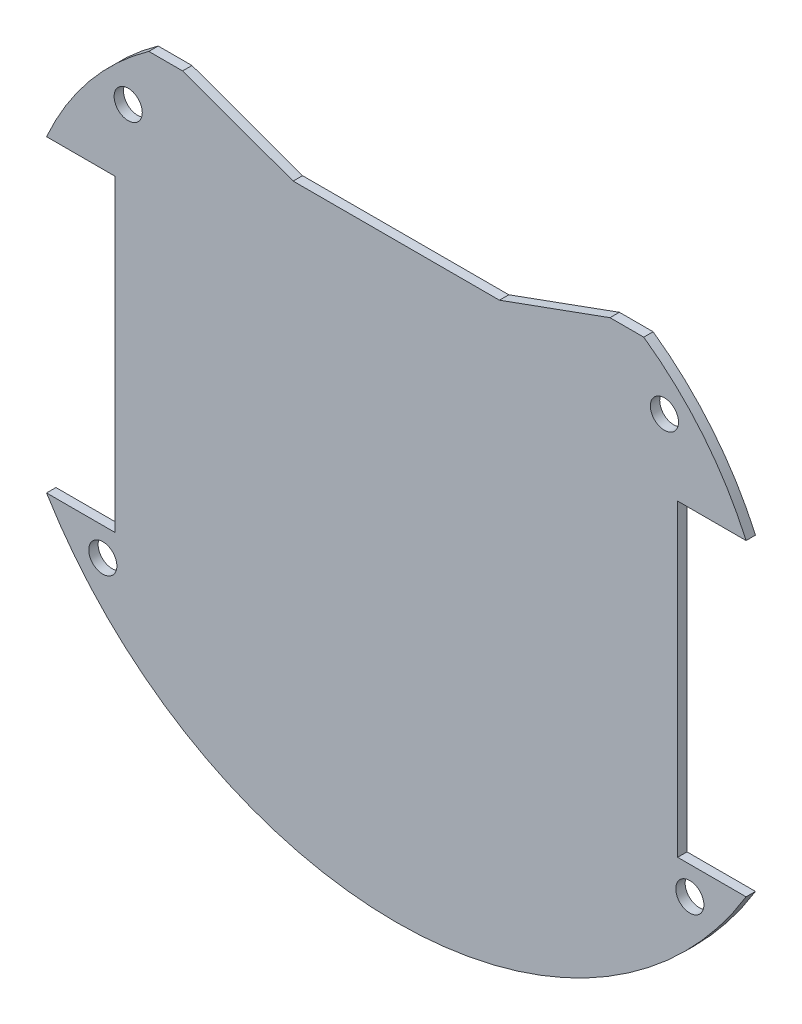
ISO-10303-21;
HEADER;
FILE_DESCRIPTION(('STEP AP214'),'2;1');
FILE_NAME('part.step','',(''),(''),'','','');
FILE_SCHEMA(('AUTOMOTIVE_DESIGN { 1 0 10303 214 1 1 1 1 }'));
ENDSEC;
DATA;
#1=APPLICATION_CONTEXT('core data for automotive mechanical design processes');
#2=APPLICATION_PROTOCOL_DEFINITION('international standard','automotive_design',2000,#1);
#3=PRODUCT_CONTEXT('',#1,'mechanical');
#4=PRODUCT('Part','Part','',(#3));
#5=PRODUCT_RELATED_PRODUCT_CATEGORY('part','',(#4));
#6=PRODUCT_DEFINITION_FORMATION('','',#4);
#7=PRODUCT_DEFINITION_CONTEXT('part definition',#1,'design');
#8=PRODUCT_DEFINITION('design','',#6,#7);
#9=PRODUCT_DEFINITION_SHAPE('','',#8);
#10=(LENGTH_UNIT() NAMED_UNIT(*) SI_UNIT(.MILLI.,.METRE.));
#11=(NAMED_UNIT(*) PLANE_ANGLE_UNIT() SI_UNIT($,.RADIAN.));
#12=(NAMED_UNIT(*) SI_UNIT($,.STERADIAN.) SOLID_ANGLE_UNIT());
#13=UNCERTAINTY_MEASURE_WITH_UNIT(LENGTH_MEASURE(1.E-05),#10,'distance_accuracy_value','');
#14=(GEOMETRIC_REPRESENTATION_CONTEXT(3) GLOBAL_UNCERTAINTY_ASSIGNED_CONTEXT((#13)) GLOBAL_UNIT_ASSIGNED_CONTEXT((#10,
#11,#12)) REPRESENTATION_CONTEXT('',''));
#15=CARTESIAN_POINT('',(0.,0.,0.));
#16=DIRECTION('',(0.,0.,1.));
#17=DIRECTION('',(1.,0.,0.));
#18=AXIS2_PLACEMENT_3D('',#15,#16,#17);
#19=CARTESIAN_POINT('',(0.,0.,0.));
#20=DIRECTION('',(0.,0.,1.));
#21=DIRECTION('',(1.,0.,0.));
#22=AXIS2_PLACEMENT_3D('',#19,#20,#21);
#23=PLANE('',#22);
#24=CARTESIAN_POINT('',(-31.299711921146,-19.4492983568228,0.));
#25=DIRECTION('',(0.,0.,1.));
#26=DIRECTION('',(1.,0.,0.));
#27=AXIS2_PLACEMENT_3D('',#24,#25,#26);
#28=CIRCLE('',#27,1.5);
#29=CARTESIAN_POINT('',(-29.799711921146,-19.4492983568228,0.));
#30=VERTEX_POINT('',#29);
#31=EDGE_CURVE('E146',#30,#30,#28,.T.);
#32=ORIENTED_EDGE('',*,*,#31,.T.);
#33=EDGE_LOOP('',(#32));
#34=FACE_BOUND('',#33,.T.);
#35=CARTESIAN_POINT('',(31.2997119211459,-19.4492983568228,0.));
#36=DIRECTION('',(0.,0.,1.));
#37=DIRECTION('',(1.,0.,0.));
#38=AXIS2_PLACEMENT_3D('',#35,#36,#37);
#39=CIRCLE('',#38,1.5);
#40=CARTESIAN_POINT('',(32.7997119211459,-19.4492983568228,0.));
#41=VERTEX_POINT('',#40);
#42=EDGE_CURVE('E484',#41,#41,#39,.T.);
#43=ORIENTED_EDGE('',*,*,#42,.T.);
#44=EDGE_LOOP('',(#43));
#45=FACE_BOUND('',#44,.T.);
#46=CARTESIAN_POINT('',(-28.5900387108147,23.7802641955972,0.));
#47=DIRECTION('',(0.,0.,1.));
#48=DIRECTION('',(1.,0.,0.));
#49=AXIS2_PLACEMENT_3D('',#46,#47,#48);
#50=CIRCLE('',#49,1.5);
#51=CARTESIAN_POINT('',(-27.0900387108147,23.7802641955972,0.));
#52=VERTEX_POINT('',#51);
#53=EDGE_CURVE('E242',#52,#52,#50,.T.);
#54=ORIENTED_EDGE('',*,*,#53,.T.);
#55=EDGE_LOOP('',(#54));
#56=FACE_BOUND('',#55,.T.);
#57=CARTESIAN_POINT('',(28.5900387108147,23.7802641955972,0.));
#58=DIRECTION('',(0.,0.,1.));
#59=DIRECTION('',(-1.,0.,0.));
#60=AXIS2_PLACEMENT_3D('',#57,#58,#59);
#61=CIRCLE('',#60,1.5);
#62=CARTESIAN_POINT('',(27.0900387108147,23.7802641955972,0.));
#63=VERTEX_POINT('',#62);
#64=EDGE_CURVE('E241',#63,#63,#61,.T.);
#65=ORIENTED_EDGE('',*,*,#64,.T.);
#66=EDGE_LOOP('',(#65));
#67=FACE_BOUND('',#66,.T.);
#68=DIRECTION('',(1.,0.,0.));
#69=VECTOR('',#68,1.);
#70=CARTESIAN_POINT('',(0.,-16.4492983568228,0.));
#71=LINE('',#70,#69);
#72=CARTESIAN_POINT('',(30.,-16.4492983568228,0.));
#73=VERTEX_POINT('',#72);
#74=CARTESIAN_POINT('',(37.299711921146,-16.4492983568227,0.));
#75=VERTEX_POINT('',#74);
#76=EDGE_CURVE('E177',#73,#75,#71,.T.);
#77=ORIENTED_EDGE('',*,*,#76,.T.);
#78=CARTESIAN_POINT('',(0.,6.15877791092165,0.));
#79=DIRECTION('',(0.,0.,1.));
#80=DIRECTION('',(1.,0.,0.));
#81=AXIS2_PLACEMENT_3D('',#78,#79,#80);
#82=CIRCLE('',#81,43.6164375199147);
#83=CARTESIAN_POINT('',(-37.299711921146,-16.4492983568228,0.));
#84=VERTEX_POINT('',#83);
#85=EDGE_CURVE('E250',#84,#75,#82,.T.);
#86=ORIENTED_EDGE('',*,*,#85,.F.);
#87=DIRECTION('',(-1.,0.,0.));
#88=VECTOR('',#87,1.);
#89=CARTESIAN_POINT('',(0.,-16.4492983568228,0.));
#90=LINE('',#89,#88);
#91=CARTESIAN_POINT('',(-30.,-16.4492983568228,0.));
#92=VERTEX_POINT('',#91);
#93=EDGE_CURVE('E190',#92,#84,#90,.T.);
#94=ORIENTED_EDGE('',*,*,#93,.F.);
#95=DIRECTION('',(0.,1.,0.));
#96=VECTOR('',#95,1.);
#97=CARTESIAN_POINT('',(-30.,16.4492983568228,0.));
#98=LINE('',#97,#96);
#99=CARTESIAN_POINT('',(-30.,16.4492983568228,0.));
#100=VERTEX_POINT('',#99);
#101=EDGE_CURVE('E171',#92,#100,#98,.T.);
#102=ORIENTED_EDGE('',*,*,#101,.T.);
#103=DIRECTION('',(-1.,0.,0.));
#104=VECTOR('',#103,1.);
#105=CARTESIAN_POINT('',(0.,16.4492983568228,0.));
#106=LINE('',#105,#104);
#107=CARTESIAN_POINT('',(-37.299711921146,16.4492983568228,0.));
#108=VERTEX_POINT('',#107);
#109=EDGE_CURVE('E188',#100,#108,#106,.T.);
#110=ORIENTED_EDGE('',*,*,#109,.T.);
#111=CARTESIAN_POINT('',(-7.61252759266184,3.28373542568487,0.));
#112=DIRECTION('',(0.,0.,1.));
#113=DIRECTION('',(-1.,0.,0.));
#114=AXIS2_PLACEMENT_3D('',#111,#112,#113);
#115=CIRCLE('',#114,32.4755440392789);
#116=CARTESIAN_POINT('',(-26.3900387108147,29.7802641955972,0.));
#117=VERTEX_POINT('',#116);
#118=EDGE_CURVE('E160',#117,#108,#115,.T.);
#119=ORIENTED_EDGE('',*,*,#118,.F.);
#120=DIRECTION('',(-1.,0.,0.));
#121=VECTOR('',#120,1.);
#122=CARTESIAN_POINT('',(-22.7900387108147,29.7802641955972,0.));
#123=LINE('',#122,#121);
#124=CARTESIAN_POINT('',(-22.7900387108147,29.7802641955972,0.));
#125=VERTEX_POINT('',#124);
#126=EDGE_CURVE('E257',#125,#117,#123,.T.);
#127=ORIENTED_EDGE('',*,*,#126,.F.);
#128=DIRECTION('',(-0.939973110395639,0.341248519019714,0.));
#129=VECTOR('',#128,1.);
#130=CARTESIAN_POINT('',(6.89853694287745,19.0021021805552,0.));
#131=LINE('',#130,#129);
#132=CARTESIAN_POINT('',(-11.,25.5,0.));
#133=VERTEX_POINT('',#132);
#134=EDGE_CURVE('E192',#133,#125,#131,.T.);
#135=ORIENTED_EDGE('',*,*,#134,.F.);
#136=DIRECTION('',(-1.,0.,0.));
#137=VECTOR('',#136,1.);
#138=CARTESIAN_POINT('',(0.,25.5,0.));
#139=LINE('',#138,#137);
#140=CARTESIAN_POINT('',(11.,25.5,0.));
#141=VERTEX_POINT('',#140);
#142=EDGE_CURVE('E197',#141,#133,#139,.T.);
#143=ORIENTED_EDGE('',*,*,#142,.F.);
#144=DIRECTION('',(0.939973110395639,0.341248519019713,0.));
#145=VECTOR('',#144,1.);
#146=CARTESIAN_POINT('',(-6.89853694287744,19.0021021805552,0.));
#147=LINE('',#146,#145);
#148=CARTESIAN_POINT('',(22.7900387108147,29.7802641955972,0.));
#149=VERTEX_POINT('',#148);
#150=EDGE_CURVE('E194',#141,#149,#147,.T.);
#151=ORIENTED_EDGE('',*,*,#150,.T.);
#152=DIRECTION('',(-1.,0.,0.));
#153=VECTOR('',#152,1.);
#154=CARTESIAN_POINT('',(22.7900387108147,29.7802641955972,0.));
#155=LINE('',#154,#153);
#156=CARTESIAN_POINT('',(26.3900387108147,29.7802641955972,0.));
#157=VERTEX_POINT('',#156);
#158=EDGE_CURVE('E213',#157,#149,#155,.T.);
#159=ORIENTED_EDGE('',*,*,#158,.F.);
#160=CARTESIAN_POINT('',(7.61252759266184,3.28373542568486,0.));
#161=DIRECTION('',(0.,0.,1.));
#162=DIRECTION('',(1.,0.,0.));
#163=AXIS2_PLACEMENT_3D('',#160,#161,#162);
#164=CIRCLE('',#163,32.4755440392789);
#165=CARTESIAN_POINT('',(37.299711921146,16.4492983568228,0.));
#166=VERTEX_POINT('',#165);
#167=EDGE_CURVE('E221',#166,#157,#164,.T.);
#168=ORIENTED_EDGE('',*,*,#167,.F.);
#169=DIRECTION('',(1.,0.,0.));
#170=VECTOR('',#169,1.);
#171=CARTESIAN_POINT('',(0.,16.4492983568228,0.));
#172=LINE('',#171,#170);
#173=CARTESIAN_POINT('',(30.,16.4492983568228,0.));
#174=VERTEX_POINT('',#173);
#175=EDGE_CURVE('E186',#174,#166,#172,.T.);
#176=ORIENTED_EDGE('',*,*,#175,.F.);
#177=DIRECTION('',(0.,-1.,0.));
#178=VECTOR('',#177,1.);
#179=CARTESIAN_POINT('',(30.,16.4492983568228,0.));
#180=LINE('',#179,#178);
#181=EDGE_CURVE('E161',#174,#73,#180,.T.);
#182=ORIENTED_EDGE('',*,*,#181,.T.);
#183=EDGE_LOOP('',(#77,#86,#94,#102,#110,#119,#127,#135,#143,#151,#159,#168,#176,#182));
#184=FACE_BOUND('',#183,.T.);
#185=ADVANCED_FACE('F34',(#34,#45,#56,#67,#184),#23,.F.);
#186=CARTESIAN_POINT('',(6.89853694287745,19.0021021805552,3.));
#187=DIRECTION('',(-0.341248519019714,-0.939973110395639,0.));
#188=DIRECTION('',(0.939973110395639,-0.341248519019714,0.));
#189=AXIS2_PLACEMENT_3D('',#186,#187,#188);
#190=PLANE('',#189);
#191=DIRECTION('',(0.,0.,-1.));
#192=VECTOR('',#191,1.);
#193=CARTESIAN_POINT('',(-22.7900387108147,29.7802641955972,3.));
#194=LINE('',#193,#192);
#195=CARTESIAN_POINT('',(-22.7900387108147,29.7802641955972,1.));
#196=VERTEX_POINT('',#195);
#197=EDGE_CURVE('E11',#196,#125,#194,.T.);
#198=ORIENTED_EDGE('',*,*,#197,.F.);
#199=DIRECTION('',(-0.939973110395639,0.341248519019714,0.));
#200=VECTOR('',#199,1.);
#201=CARTESIAN_POINT('',(-11.,25.5,1.));
#202=LINE('',#201,#200);
#203=CARTESIAN_POINT('',(-11.,25.5,1.));
#204=VERTEX_POINT('',#203);
#205=EDGE_CURVE('E230',#204,#196,#202,.T.);
#206=ORIENTED_EDGE('',*,*,#205,.F.);
#207=DIRECTION('',(0.,0.,-1.));
#208=VECTOR('',#207,1.);
#209=CARTESIAN_POINT('',(-11.,25.5,3.));
#210=LINE('',#209,#208);
#211=EDGE_CURVE('E58',#204,#133,#210,.T.);
#212=ORIENTED_EDGE('',*,*,#211,.T.);
#213=ORIENTED_EDGE('',*,*,#134,.T.);
#214=EDGE_LOOP('',(#198,#206,#212,#213));
#215=FACE_BOUND('',#214,.T.);
#216=ADVANCED_FACE('F36',(#215),#190,.F.);
#217=CARTESIAN_POINT('',(-6.89853694287744,19.0021021805552,3.));
#218=DIRECTION('',(-0.341248519019714,0.939973110395639,0.));
#219=DIRECTION('',(-0.939973110395639,-0.341248519019714,0.));
#220=AXIS2_PLACEMENT_3D('',#217,#218,#219);
#221=PLANE('',#220);
#222=DIRECTION('',(-0.939973110395639,-0.341248519019713,0.));
#223=VECTOR('',#222,1.);
#224=CARTESIAN_POINT('',(22.7900387108147,29.7802641955972,1.));
#225=LINE('',#224,#223);
#226=CARTESIAN_POINT('',(22.7900387108147,29.7802641955972,1.));
#227=VERTEX_POINT('',#226);
#228=CARTESIAN_POINT('',(11.,25.5,1.));
#229=VERTEX_POINT('',#228);
#230=EDGE_CURVE('E209',#227,#229,#225,.T.);
#231=ORIENTED_EDGE('',*,*,#230,.F.);
#232=DIRECTION('',(0.,0.,-1.));
#233=VECTOR('',#232,1.);
#234=CARTESIAN_POINT('',(22.7900387108147,29.7802641955972,3.));
#235=LINE('',#234,#233);
#236=EDGE_CURVE('E43',#227,#149,#235,.T.);
#237=ORIENTED_EDGE('',*,*,#236,.T.);
#238=ORIENTED_EDGE('',*,*,#150,.F.);
#239=DIRECTION('',(0.,0.,-1.));
#240=VECTOR('',#239,1.);
#241=CARTESIAN_POINT('',(11.,25.5,3.));
#242=LINE('',#241,#240);
#243=EDGE_CURVE('E200',#229,#141,#242,.T.);
#244=ORIENTED_EDGE('',*,*,#243,.F.);
#245=EDGE_LOOP('',(#231,#237,#238,#244));
#246=FACE_BOUND('',#245,.T.);
#247=ADVANCED_FACE('F207',(#246),#221,.T.);
#248=CARTESIAN_POINT('',(0.,25.5,3.));
#249=DIRECTION('',(0.,-1.,0.));
#250=DIRECTION('',(1.,0.,0.));
#251=AXIS2_PLACEMENT_3D('',#248,#249,#250);
#252=PLANE('',#251);
#253=ORIENTED_EDGE('',*,*,#211,.F.);
#254=DIRECTION('',(-1.,0.,0.));
#255=VECTOR('',#254,1.);
#256=CARTESIAN_POINT('',(11.,25.5,1.));
#257=LINE('',#256,#255);
#258=EDGE_CURVE('E229',#229,#204,#257,.T.);
#259=ORIENTED_EDGE('',*,*,#258,.F.);
#260=ORIENTED_EDGE('',*,*,#243,.T.);
#261=ORIENTED_EDGE('',*,*,#142,.T.);
#262=EDGE_LOOP('',(#253,#259,#260,#261));
#263=FACE_BOUND('',#262,.T.);
#264=ADVANCED_FACE('F227',(#263),#252,.F.);
#265=CARTESIAN_POINT('',(0.,-16.4492983568228,0.));
#266=DIRECTION('',(0.,1.,0.));
#267=DIRECTION('',(0.,0.,1.));
#268=AXIS2_PLACEMENT_3D('',#265,#266,#267);
#269=PLANE('',#268);
#270=DIRECTION('',(-1.,0.,0.));
#271=VECTOR('',#270,1.);
#272=CARTESIAN_POINT('',(-30.,-16.4492983568228,1.));
#273=LINE('',#272,#271);
#274=CARTESIAN_POINT('',(-30.,-16.4492983568228,1.));
#275=VERTEX_POINT('',#274);
#276=CARTESIAN_POINT('',(-37.299711921146,-16.4492983568228,1.));
#277=VERTEX_POINT('',#276);
#278=EDGE_CURVE('E50',#275,#277,#273,.T.);
#279=ORIENTED_EDGE('',*,*,#278,.F.);
#280=DIRECTION('',(0.,0.,1.));
#281=VECTOR('',#280,1.);
#282=CARTESIAN_POINT('',(-30.,-16.4492983568228,0.));
#283=LINE('',#282,#281);
#284=EDGE_CURVE('E174',#92,#275,#283,.T.);
#285=ORIENTED_EDGE('',*,*,#284,.F.);
#286=ORIENTED_EDGE('',*,*,#93,.T.);
#287=DIRECTION('',(0.,0.,1.));
#288=VECTOR('',#287,1.);
#289=CARTESIAN_POINT('',(-37.299711921146,-16.4492983568228,0.));
#290=LINE('',#289,#288);
#291=EDGE_CURVE('E252',#84,#277,#290,.T.);
#292=ORIENTED_EDGE('',*,*,#291,.T.);
#293=EDGE_LOOP('',(#279,#285,#286,#292));
#294=FACE_BOUND('',#293,.T.);
#295=ADVANCED_FACE('F301',(#294),#269,.T.);
#296=CARTESIAN_POINT('',(0.,16.4492983568228,0.));
#297=DIRECTION('',(0.,1.,0.));
#298=DIRECTION('',(0.,0.,1.));
#299=AXIS2_PLACEMENT_3D('',#296,#297,#298);
#300=PLANE('',#299);
#301=DIRECTION('',(0.,0.,1.));
#302=VECTOR('',#301,1.);
#303=CARTESIAN_POINT('',(-30.,16.4492983568228,0.));
#304=LINE('',#303,#302);
#305=CARTESIAN_POINT('',(-30.,16.4492983568228,1.));
#306=VERTEX_POINT('',#305);
#307=EDGE_CURVE('E155',#100,#306,#304,.T.);
#308=ORIENTED_EDGE('',*,*,#307,.T.);
#309=DIRECTION('',(1.,0.,0.));
#310=VECTOR('',#309,1.);
#311=CARTESIAN_POINT('',(-37.299711921146,16.4492983568228,1.));
#312=LINE('',#311,#310);
#313=CARTESIAN_POINT('',(-37.299711921146,16.4492983568228,1.));
#314=VERTEX_POINT('',#313);
#315=EDGE_CURVE('E139',#314,#306,#312,.T.);
#316=ORIENTED_EDGE('',*,*,#315,.F.);
#317=DIRECTION('',(0.,0.,1.));
#318=VECTOR('',#317,1.);
#319=CARTESIAN_POINT('',(-37.299711921146,16.4492983568228,0.));
#320=LINE('',#319,#318);
#321=EDGE_CURVE('E152',#108,#314,#320,.T.);
#322=ORIENTED_EDGE('',*,*,#321,.F.);
#323=ORIENTED_EDGE('',*,*,#109,.F.);
#324=EDGE_LOOP('',(#308,#316,#322,#323));
#325=FACE_BOUND('',#324,.T.);
#326=ADVANCED_FACE('F151',(#325),#300,.F.);
#327=CARTESIAN_POINT('',(0.,16.4492983568228,0.));
#328=DIRECTION('',(0.,-1.,0.));
#329=DIRECTION('',(0.,0.,-1.));
#330=AXIS2_PLACEMENT_3D('',#327,#328,#329);
#331=PLANE('',#330);
#332=DIRECTION('',(1.,0.,0.));
#333=VECTOR('',#332,1.);
#334=CARTESIAN_POINT('',(30.,16.4492983568228,1.));
#335=LINE('',#334,#333);
#336=CARTESIAN_POINT('',(30.,16.4492983568228,1.));
#337=VERTEX_POINT('',#336);
#338=CARTESIAN_POINT('',(37.299711921146,16.4492983568228,1.));
#339=VERTEX_POINT('',#338);
#340=EDGE_CURVE('E276',#337,#339,#335,.T.);
#341=ORIENTED_EDGE('',*,*,#340,.F.);
#342=DIRECTION('',(0.,0.,1.));
#343=VECTOR('',#342,1.);
#344=CARTESIAN_POINT('',(30.,16.4492983568228,0.));
#345=LINE('',#344,#343);
#346=EDGE_CURVE('E165',#174,#337,#345,.T.);
#347=ORIENTED_EDGE('',*,*,#346,.F.);
#348=ORIENTED_EDGE('',*,*,#175,.T.);
#349=DIRECTION('',(0.,0.,1.));
#350=VECTOR('',#349,1.);
#351=CARTESIAN_POINT('',(37.299711921146,16.4492983568228,0.));
#352=LINE('',#351,#350);
#353=EDGE_CURVE('E220',#166,#339,#352,.T.);
#354=ORIENTED_EDGE('',*,*,#353,.T.);
#355=EDGE_LOOP('',(#341,#347,#348,#354));
#356=FACE_BOUND('',#355,.T.);
#357=ADVANCED_FACE('F287',(#356),#331,.T.);
#358=CARTESIAN_POINT('',(0.,-16.4492983568228,0.));
#359=DIRECTION('',(0.,-1.,0.));
#360=DIRECTION('',(0.,0.,-1.));
#361=AXIS2_PLACEMENT_3D('',#358,#359,#360);
#362=PLANE('',#361);
#363=DIRECTION('',(0.,0.,1.));
#364=VECTOR('',#363,1.);
#365=CARTESIAN_POINT('',(30.,-16.4492983568228,0.));
#366=LINE('',#365,#364);
#367=CARTESIAN_POINT('',(30.,-16.4492983568228,1.));
#368=VERTEX_POINT('',#367);
#369=EDGE_CURVE('E175',#73,#368,#366,.T.);
#370=ORIENTED_EDGE('',*,*,#369,.T.);
#371=DIRECTION('',(-1.,0.,0.));
#372=VECTOR('',#371,1.);
#373=CARTESIAN_POINT('',(37.299711921146,-16.4492983568227,1.));
#374=LINE('',#373,#372);
#375=CARTESIAN_POINT('',(37.2997119211459,-16.4492983568228,1.));
#376=VERTEX_POINT('',#375);
#377=EDGE_CURVE('E272',#376,#368,#374,.T.);
#378=ORIENTED_EDGE('',*,*,#377,.F.);
#379=DIRECTION('',(0.,0.,1.));
#380=VECTOR('',#379,1.);
#381=CARTESIAN_POINT('',(37.299711921146,-16.4492983568227,0.));
#382=LINE('',#381,#380);
#383=EDGE_CURVE('E245',#75,#376,#382,.T.);
#384=ORIENTED_EDGE('',*,*,#383,.F.);
#385=ORIENTED_EDGE('',*,*,#76,.F.);
#386=EDGE_LOOP('',(#370,#378,#384,#385));
#387=FACE_BOUND('',#386,.T.);
#388=ADVANCED_FACE('F294',(#387),#362,.F.);
#389=CARTESIAN_POINT('',(-30.,16.4492983568228,0.));
#390=DIRECTION('',(1.,0.,0.));
#391=DIRECTION('',(0.,1.,0.));
#392=AXIS2_PLACEMENT_3D('',#389,#390,#391);
#393=PLANE('',#392);
#394=ORIENTED_EDGE('',*,*,#284,.T.);
#395=DIRECTION('',(0.,-1.,0.));
#396=VECTOR('',#395,1.);
#397=CARTESIAN_POINT('',(-30.,16.4492983568228,1.));
#398=LINE('',#397,#396);
#399=EDGE_CURVE('E156',#306,#275,#398,.T.);
#400=ORIENTED_EDGE('',*,*,#399,.F.);
#401=ORIENTED_EDGE('',*,*,#307,.F.);
#402=ORIENTED_EDGE('',*,*,#101,.F.);
#403=EDGE_LOOP('',(#394,#400,#401,#402));
#404=FACE_BOUND('',#403,.T.);
#405=ADVANCED_FACE('F265',(#404),#393,.F.);
#406=CARTESIAN_POINT('',(30.,16.4492983568228,0.));
#407=DIRECTION('',(-1.,0.,0.));
#408=DIRECTION('',(0.,-1.,0.));
#409=AXIS2_PLACEMENT_3D('',#406,#407,#408);
#410=PLANE('',#409);
#411=ORIENTED_EDGE('',*,*,#346,.T.);
#412=DIRECTION('',(0.,1.,0.));
#413=VECTOR('',#412,1.);
#414=CARTESIAN_POINT('',(30.,-16.4492983568228,1.));
#415=LINE('',#414,#413);
#416=EDGE_CURVE('E274',#368,#337,#415,.T.);
#417=ORIENTED_EDGE('',*,*,#416,.F.);
#418=ORIENTED_EDGE('',*,*,#369,.F.);
#419=ORIENTED_EDGE('',*,*,#181,.F.);
#420=EDGE_LOOP('',(#411,#417,#418,#419));
#421=FACE_BOUND('',#420,.T.);
#422=ADVANCED_FACE('F291',(#421),#410,.F.);
#423=CARTESIAN_POINT('',(-7.61252759266184,3.28373542568487,0.));
#424=DIRECTION('',(0.,0.,1.));
#425=DIRECTION('',(1.,0.,0.));
#426=AXIS2_PLACEMENT_3D('',#423,#424,#425);
#427=CYLINDRICAL_SURFACE('',#426,32.4755440392789);
#428=CARTESIAN_POINT('',(-7.61252759266077,3.28373542568401,1.));
#429=DIRECTION('',(0.,0.,1.));
#430=DIRECTION('',(-1.,0.,0.));
#431=AXIS2_PLACEMENT_3D('',#428,#429,#430);
#432=CIRCLE('',#431,32.4755440392803);
#433=CARTESIAN_POINT('',(-26.3900387108147,29.7802641955972,1.));
#434=VERTEX_POINT('',#433);
#435=EDGE_CURVE('E135',#434,#314,#432,.T.);
#436=ORIENTED_EDGE('',*,*,#435,.F.);
#437=DIRECTION('',(0.,0.,1.));
#438=VECTOR('',#437,1.);
#439=CARTESIAN_POINT('',(-26.3900387108147,29.7802641955972,0.));
#440=LINE('',#439,#438);
#441=EDGE_CURVE('E162',#117,#434,#440,.T.);
#442=ORIENTED_EDGE('',*,*,#441,.F.);
#443=ORIENTED_EDGE('',*,*,#118,.T.);
#444=ORIENTED_EDGE('',*,*,#321,.T.);
#445=EDGE_LOOP('',(#436,#442,#443,#444));
#446=FACE_BOUND('',#445,.T.);
#447=ADVANCED_FACE('F158',(#446),#427,.T.);
#448=CARTESIAN_POINT('',(-22.7900387108147,29.7802641955972,0.));
#449=DIRECTION('',(0.,1.,0.));
#450=DIRECTION('',(0.,0.,1.));
#451=AXIS2_PLACEMENT_3D('',#448,#449,#450);
#452=PLANE('',#451);
#453=DIRECTION('',(-1.,0.,0.));
#454=VECTOR('',#453,1.);
#455=CARTESIAN_POINT('',(-22.7900387108147,29.7802641955972,1.));
#456=LINE('',#455,#454);
#457=EDGE_CURVE('E142',#196,#434,#456,.T.);
#458=ORIENTED_EDGE('',*,*,#457,.F.);
#459=ORIENTED_EDGE('',*,*,#197,.T.);
#460=ORIENTED_EDGE('',*,*,#126,.T.);
#461=ORIENTED_EDGE('',*,*,#441,.T.);
#462=EDGE_LOOP('',(#458,#459,#460,#461));
#463=FACE_BOUND('',#462,.T.);
#464=ADVANCED_FACE('F261',(#463),#452,.T.);
#465=CARTESIAN_POINT('',(22.7900387108147,29.7802641955972,0.));
#466=DIRECTION('',(0.,1.,0.));
#467=DIRECTION('',(0.,0.,1.));
#468=AXIS2_PLACEMENT_3D('',#465,#466,#467);
#469=PLANE('',#468);
#470=DIRECTION('',(-1.,0.,0.));
#471=VECTOR('',#470,1.);
#472=CARTESIAN_POINT('',(26.3900387108147,29.7802641955972,1.));
#473=LINE('',#472,#471);
#474=CARTESIAN_POINT('',(26.3900387108147,29.7802641955972,1.));
#475=VERTEX_POINT('',#474);
#476=EDGE_CURVE('E233',#475,#227,#473,.T.);
#477=ORIENTED_EDGE('',*,*,#476,.F.);
#478=DIRECTION('',(0.,0.,1.));
#479=VECTOR('',#478,1.);
#480=CARTESIAN_POINT('',(26.3900387108147,29.7802641955972,0.));
#481=LINE('',#480,#479);
#482=EDGE_CURVE('E216',#157,#475,#481,.T.);
#483=ORIENTED_EDGE('',*,*,#482,.F.);
#484=ORIENTED_EDGE('',*,*,#158,.T.);
#485=ORIENTED_EDGE('',*,*,#236,.F.);
#486=EDGE_LOOP('',(#477,#483,#484,#485));
#487=FACE_BOUND('',#486,.T.);
#488=ADVANCED_FACE('F214',(#487),#469,.T.);
#489=CARTESIAN_POINT('',(7.61252759266184,3.28373542568486,0.));
#490=DIRECTION('',(0.,0.,1.));
#491=DIRECTION('',(1.,0.,0.));
#492=AXIS2_PLACEMENT_3D('',#489,#490,#491);
#493=CYLINDRICAL_SURFACE('',#492,32.4755440392789);
#494=CARTESIAN_POINT('',(7.61252759266177,3.28373542568478,1.));
#495=DIRECTION('',(0.,0.,1.));
#496=DIRECTION('',(1.,0.,0.));
#497=AXIS2_PLACEMENT_3D('',#494,#495,#496);
#498=CIRCLE('',#497,32.475544039279);
#499=EDGE_CURVE('E278',#339,#475,#498,.T.);
#500=ORIENTED_EDGE('',*,*,#499,.F.);
#501=ORIENTED_EDGE('',*,*,#353,.F.);
#502=ORIENTED_EDGE('',*,*,#167,.T.);
#503=ORIENTED_EDGE('',*,*,#482,.T.);
#504=EDGE_LOOP('',(#500,#501,#502,#503));
#505=FACE_BOUND('',#504,.T.);
#506=ADVANCED_FACE('F281',(#505),#493,.T.);
#507=CARTESIAN_POINT('',(0.,6.15877791092165,0.));
#508=DIRECTION('',(0.,0.,1.));
#509=DIRECTION('',(1.,0.,0.));
#510=AXIS2_PLACEMENT_3D('',#507,#508,#509);
#511=CYLINDRICAL_SURFACE('',#510,43.6164375199147);
#512=CARTESIAN_POINT('',(0.,6.15877791092167,1.));
#513=DIRECTION('',(0.,0.,1.));
#514=DIRECTION('',(1.,0.,0.));
#515=AXIS2_PLACEMENT_3D('',#512,#513,#514);
#516=CIRCLE('',#515,43.6164375199147);
#517=EDGE_CURVE('E268',#277,#376,#516,.T.);
#518=ORIENTED_EDGE('',*,*,#517,.F.);
#519=ORIENTED_EDGE('',*,*,#291,.F.);
#520=ORIENTED_EDGE('',*,*,#85,.T.);
#521=ORIENTED_EDGE('',*,*,#383,.T.);
#522=EDGE_LOOP('',(#518,#519,#520,#521));
#523=FACE_BOUND('',#522,.T.);
#524=ADVANCED_FACE('F299',(#523),#511,.T.);
#525=CARTESIAN_POINT('',(28.5900387108147,23.7802641955972,0.));
#526=DIRECTION('',(0.,0.,1.));
#527=DIRECTION('',(1.,0.,0.));
#528=AXIS2_PLACEMENT_3D('',#525,#526,#527);
#529=CYLINDRICAL_SURFACE('',#528,1.5);
#530=CARTESIAN_POINT('',(28.5900387108147,23.7802641955972,1.));
#531=DIRECTION('',(0.,0.,-1.));
#532=DIRECTION('',(-1.,0.,0.));
#533=AXIS2_PLACEMENT_3D('',#530,#531,#532);
#534=CIRCLE('',#533,1.5);
#535=CARTESIAN_POINT('',(27.0900387108147,23.7802641955972,1.));
#536=VERTEX_POINT('',#535);
#537=EDGE_CURVE('E238',#536,#536,#534,.F.);
#538=ORIENTED_EDGE('',*,*,#537,.T.);
#539=EDGE_LOOP('',(#538));
#540=FACE_BOUND('',#539,.T.);
#541=ORIENTED_EDGE('',*,*,#64,.F.);
#542=EDGE_LOOP('',(#541));
#543=FACE_BOUND('',#542,.T.);
#544=ADVANCED_FACE('F420',(#540,#543),#529,.F.);
#545=CARTESIAN_POINT('',(-28.5900387108147,23.7802641955972,0.));
#546=DIRECTION('',(0.,0.,1.));
#547=DIRECTION('',(1.,0.,0.));
#548=AXIS2_PLACEMENT_3D('',#545,#546,#547);
#549=CYLINDRICAL_SURFACE('',#548,1.5);
#550=CARTESIAN_POINT('',(-28.5900387108147,23.7802641955972,1.));
#551=DIRECTION('',(0.,0.,-1.));
#552=DIRECTION('',(-1.,0.,0.));
#553=AXIS2_PLACEMENT_3D('',#550,#551,#552);
#554=CIRCLE('',#553,1.5);
#555=CARTESIAN_POINT('',(-30.0900387108147,23.7802641955972,1.));
#556=VERTEX_POINT('',#555);
#557=EDGE_CURVE('E38',#556,#556,#554,.F.);
#558=ORIENTED_EDGE('',*,*,#557,.T.);
#559=EDGE_LOOP('',(#558));
#560=FACE_BOUND('',#559,.T.);
#561=ORIENTED_EDGE('',*,*,#53,.F.);
#562=EDGE_LOOP('',(#561));
#563=FACE_BOUND('',#562,.T.);
#564=ADVANCED_FACE('F430',(#560,#563),#549,.F.);
#565=CARTESIAN_POINT('',(-7.61252759266077,3.28373542568401,1.));
#566=DIRECTION('',(0.,0.,-1.));
#567=DIRECTION('',(-1.,0.,0.));
#568=AXIS2_PLACEMENT_3D('',#565,#566,#567);
#569=PLANE('',#568);
#570=CARTESIAN_POINT('',(-31.299711921146,-19.4492983568228,1.));
#571=DIRECTION('',(0.,0.,1.));
#572=DIRECTION('',(1.,0.,0.));
#573=AXIS2_PLACEMENT_3D('',#570,#571,#572);
#574=CIRCLE('',#573,1.5);
#575=CARTESIAN_POINT('',(-29.799711921146,-19.4492983568228,1.));
#576=VERTEX_POINT('',#575);
#577=EDGE_CURVE('E482',#576,#576,#574,.T.);
#578=ORIENTED_EDGE('',*,*,#577,.F.);
#579=EDGE_LOOP('',(#578));
#580=FACE_BOUND('',#579,.T.);
#581=CARTESIAN_POINT('',(31.2997119211459,-19.4492983568228,1.));
#582=DIRECTION('',(0.,0.,1.));
#583=DIRECTION('',(1.,0.,0.));
#584=AXIS2_PLACEMENT_3D('',#581,#582,#583);
#585=CIRCLE('',#584,1.5);
#586=CARTESIAN_POINT('',(32.7997119211459,-19.4492983568228,1.));
#587=VERTEX_POINT('',#586);
#588=EDGE_CURVE('E489',#587,#587,#585,.T.);
#589=ORIENTED_EDGE('',*,*,#588,.F.);
#590=EDGE_LOOP('',(#589));
#591=FACE_BOUND('',#590,.T.);
#592=ORIENTED_EDGE('',*,*,#557,.F.);
#593=EDGE_LOOP('',(#592));
#594=FACE_BOUND('',#593,.T.);
#595=ORIENTED_EDGE('',*,*,#435,.T.);
#596=ORIENTED_EDGE('',*,*,#315,.T.);
#597=ORIENTED_EDGE('',*,*,#399,.T.);
#598=ORIENTED_EDGE('',*,*,#278,.T.);
#599=ORIENTED_EDGE('',*,*,#517,.T.);
#600=ORIENTED_EDGE('',*,*,#377,.T.);
#601=ORIENTED_EDGE('',*,*,#416,.T.);
#602=ORIENTED_EDGE('',*,*,#340,.T.);
#603=ORIENTED_EDGE('',*,*,#499,.T.);
#604=ORIENTED_EDGE('',*,*,#476,.T.);
#605=ORIENTED_EDGE('',*,*,#230,.T.);
#606=ORIENTED_EDGE('',*,*,#258,.T.);
#607=ORIENTED_EDGE('',*,*,#205,.T.);
#608=ORIENTED_EDGE('',*,*,#457,.T.);
#609=EDGE_LOOP('',(#595,#596,#597,#598,#599,#600,#601,#602,#603,#604,#605,#606,#607,#608));
#610=FACE_BOUND('',#609,.T.);
#611=ORIENTED_EDGE('',*,*,#537,.F.);
#612=EDGE_LOOP('',(#611));
#613=FACE_BOUND('',#612,.T.);
#614=ADVANCED_FACE('F137',(#580,#591,#594,#610,#613),#569,.F.);
#615=CARTESIAN_POINT('',(31.2997119211459,-19.4492983568228,-1.));
#616=DIRECTION('',(0.,0.,1.));
#617=DIRECTION('',(1.,0.,0.));
#618=AXIS2_PLACEMENT_3D('',#615,#616,#617);
#619=CYLINDRICAL_SURFACE('',#618,1.5);
#620=ORIENTED_EDGE('',*,*,#588,.T.);
#621=EDGE_LOOP('',(#620));
#622=FACE_BOUND('',#621,.T.);
#623=ORIENTED_EDGE('',*,*,#42,.F.);
#624=EDGE_LOOP('',(#623));
#625=FACE_BOUND('',#624,.T.);
#626=ADVANCED_FACE('F455',(#622,#625),#619,.F.);
#627=CARTESIAN_POINT('',(-31.299711921146,-19.4492983568228,-1.));
#628=DIRECTION('',(0.,0.,1.));
#629=DIRECTION('',(1.,0.,0.));
#630=AXIS2_PLACEMENT_3D('',#627,#628,#629);
#631=CYLINDRICAL_SURFACE('',#630,1.5);
#632=ORIENTED_EDGE('',*,*,#577,.T.);
#633=EDGE_LOOP('',(#632));
#634=FACE_BOUND('',#633,.T.);
#635=ORIENTED_EDGE('',*,*,#31,.F.);
#636=EDGE_LOOP('',(#635));
#637=FACE_BOUND('',#636,.T.);
#638=ADVANCED_FACE('F465',(#634,#637),#631,.F.);
#639=CLOSED_SHELL('',(#185,#216,#247,#264,#295,#326,#357,#388,#405,#422,#447,#464,#488,#506,
#524,#544,#564,#614,#626,#638));
#640=MANIFOLD_SOLID_BREP('B2',#639);
#641=ADVANCED_BREP_SHAPE_REPRESENTATION('',(#18,#640),#14);
#642=SHAPE_DEFINITION_REPRESENTATION(#9,#641);
ENDSEC;
END-ISO-10303-21;
